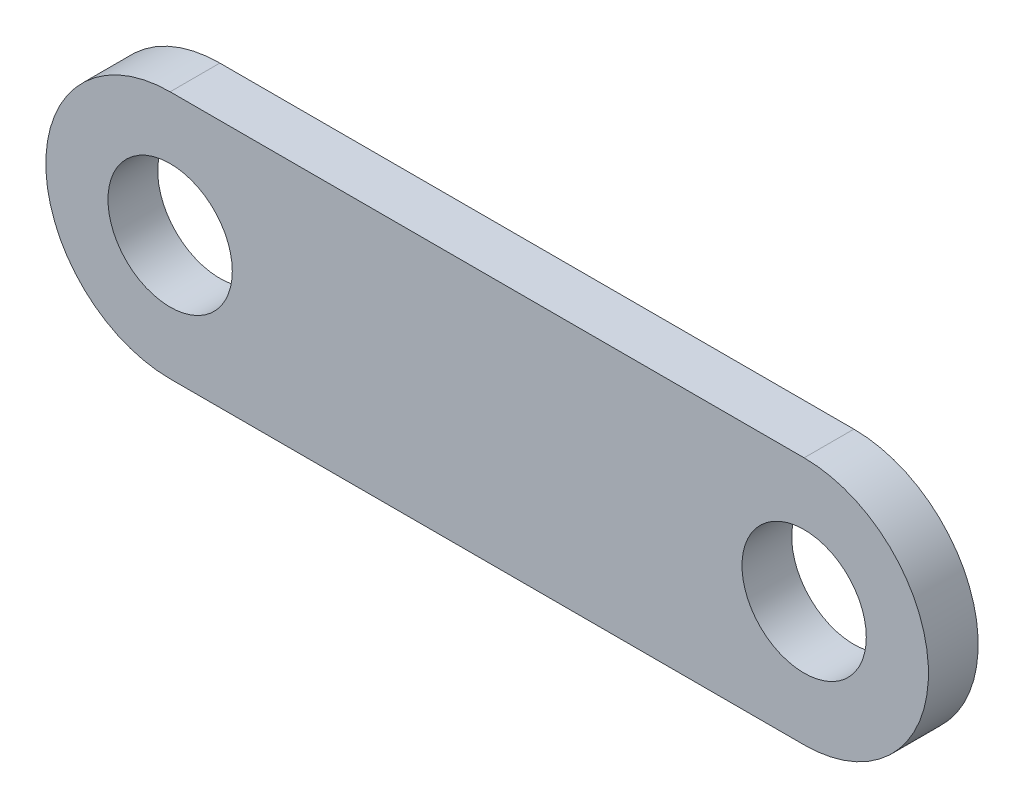
ISO-10303-21;
HEADER;
FILE_DESCRIPTION(('STEP AP214'),'2;1');
FILE_NAME('part.step','',(''),(''),'','','');
FILE_SCHEMA(('AUTOMOTIVE_DESIGN { 1 0 10303 214 1 1 1 1 }'));
ENDSEC;
DATA;
#1=APPLICATION_CONTEXT('core data for automotive mechanical design processes');
#2=APPLICATION_PROTOCOL_DEFINITION('international standard','automotive_design',2000,#1);
#3=PRODUCT_CONTEXT('',#1,'mechanical');
#4=PRODUCT('Part','Part','',(#3));
#5=PRODUCT_RELATED_PRODUCT_CATEGORY('part','',(#4));
#6=PRODUCT_DEFINITION_FORMATION('','',#4);
#7=PRODUCT_DEFINITION_CONTEXT('part definition',#1,'design');
#8=PRODUCT_DEFINITION('design','',#6,#7);
#9=PRODUCT_DEFINITION_SHAPE('','',#8);
#10=(LENGTH_UNIT() NAMED_UNIT(*) SI_UNIT(.MILLI.,.METRE.));
#11=(NAMED_UNIT(*) PLANE_ANGLE_UNIT() SI_UNIT($,.RADIAN.));
#12=(NAMED_UNIT(*) SI_UNIT($,.STERADIAN.) SOLID_ANGLE_UNIT());
#13=UNCERTAINTY_MEASURE_WITH_UNIT(LENGTH_MEASURE(1.E-05),#10,'distance_accuracy_value','');
#14=(GEOMETRIC_REPRESENTATION_CONTEXT(3) GLOBAL_UNCERTAINTY_ASSIGNED_CONTEXT((#13)) GLOBAL_UNIT_ASSIGNED_CONTEXT((#10,
#11,#12)) REPRESENTATION_CONTEXT('',''));
#15=CARTESIAN_POINT('',(0.,0.,0.));
#16=DIRECTION('',(0.,0.,1.));
#17=DIRECTION('',(1.,0.,0.));
#18=AXIS2_PLACEMENT_3D('',#15,#16,#17);
#19=CARTESIAN_POINT('',(0.,0.,10.));
#20=DIRECTION('',(0.,0.,1.));
#21=DIRECTION('',(1.,0.,0.));
#22=AXIS2_PLACEMENT_3D('',#19,#20,#21);
#23=PLANE('',#22);
#24=CARTESIAN_POINT('',(0.,0.,10.));
#25=DIRECTION('',(0.,0.,1.));
#26=DIRECTION('',(1.,0.,0.));
#27=AXIS2_PLACEMENT_3D('',#24,#25,#26);
#28=CIRCLE('',#27,25.);
#29=CARTESIAN_POINT('',(25.,0.,10.));
#30=VERTEX_POINT('',#29);
#31=EDGE_CURVE('E124',#30,#30,#28,.T.);
#32=ORIENTED_EDGE('',*,*,#31,.F.);
#33=EDGE_LOOP('',(#32));
#34=FACE_BOUND('',#33,.T.);
#35=CARTESIAN_POINT('',(0.,0.,10.));
#36=DIRECTION('',(0.,0.,1.));
#37=DIRECTION('',(1.,0.,0.));
#38=AXIS2_PLACEMENT_3D('',#35,#36,#37);
#39=CIRCLE('',#38,50.);
#40=CARTESIAN_POINT('',(0.,50.,10.));
#41=VERTEX_POINT('',#40);
#42=CARTESIAN_POINT('',(0.,-50.,10.));
#43=VERTEX_POINT('',#42);
#44=EDGE_CURVE('E104',#41,#43,#39,.T.);
#45=ORIENTED_EDGE('',*,*,#44,.T.);
#46=DIRECTION('',(1.,0.,0.));
#47=VECTOR('',#46,1.);
#48=CARTESIAN_POINT('',(0.,-50.,10.));
#49=LINE('',#48,#47);
#50=CARTESIAN_POINT('',(255.,-50.,10.));
#51=VERTEX_POINT('',#50);
#52=EDGE_CURVE('E99',#43,#51,#49,.T.);
#53=ORIENTED_EDGE('',*,*,#52,.T.);
#54=CARTESIAN_POINT('',(255.,0.,10.));
#55=DIRECTION('',(0.,0.,1.));
#56=DIRECTION('',(1.,0.,0.));
#57=AXIS2_PLACEMENT_3D('',#54,#55,#56);
#58=CIRCLE('',#57,50.);
#59=CARTESIAN_POINT('',(255.,50.,10.));
#60=VERTEX_POINT('',#59);
#61=EDGE_CURVE('E102',#51,#60,#58,.T.);
#62=ORIENTED_EDGE('',*,*,#61,.T.);
#63=DIRECTION('',(-1.,0.,0.));
#64=VECTOR('',#63,1.);
#65=CARTESIAN_POINT('',(0.,50.,10.));
#66=LINE('',#65,#64);
#67=EDGE_CURVE('E69',#60,#41,#66,.T.);
#68=ORIENTED_EDGE('',*,*,#67,.T.);
#69=EDGE_LOOP('',(#45,#53,#62,#68));
#70=FACE_BOUND('',#69,.T.);
#71=CARTESIAN_POINT('',(255.,0.,10.));
#72=DIRECTION('',(0.,0.,1.));
#73=DIRECTION('',(1.,0.,0.));
#74=AXIS2_PLACEMENT_3D('',#71,#72,#73);
#75=CIRCLE('',#74,25.);
#76=CARTESIAN_POINT('',(280.,0.,10.));
#77=VERTEX_POINT('',#76);
#78=EDGE_CURVE('E146',#77,#77,#75,.T.);
#79=ORIENTED_EDGE('',*,*,#78,.F.);
#80=EDGE_LOOP('',(#79));
#81=FACE_BOUND('',#80,.T.);
#82=ADVANCED_FACE('F51',(#34,#70,#81),#23,.T.);
#83=CARTESIAN_POINT('',(0.,0.,-10.));
#84=DIRECTION('',(0.,0.,1.));
#85=DIRECTION('',(1.,0.,0.));
#86=AXIS2_PLACEMENT_3D('',#83,#84,#85);
#87=PLANE('',#86);
#88=CARTESIAN_POINT('',(0.,0.,-10.));
#89=DIRECTION('',(0.,0.,1.));
#90=DIRECTION('',(1.,0.,0.));
#91=AXIS2_PLACEMENT_3D('',#88,#89,#90);
#92=CIRCLE('',#91,50.);
#93=CARTESIAN_POINT('',(0.,50.,-10.));
#94=VERTEX_POINT('',#93);
#95=CARTESIAN_POINT('',(0.,-50.,-10.));
#96=VERTEX_POINT('',#95);
#97=EDGE_CURVE('E120',#94,#96,#92,.T.);
#98=ORIENTED_EDGE('',*,*,#97,.F.);
#99=DIRECTION('',(-1.,0.,0.));
#100=VECTOR('',#99,1.);
#101=CARTESIAN_POINT('',(0.,50.,-10.));
#102=LINE('',#101,#100);
#103=CARTESIAN_POINT('',(255.,50.,-10.));
#104=VERTEX_POINT('',#103);
#105=EDGE_CURVE('E92',#104,#94,#102,.T.);
#106=ORIENTED_EDGE('',*,*,#105,.F.);
#107=CARTESIAN_POINT('',(255.,0.,-10.));
#108=DIRECTION('',(0.,0.,1.));
#109=DIRECTION('',(1.,0.,0.));
#110=AXIS2_PLACEMENT_3D('',#107,#108,#109);
#111=CIRCLE('',#110,50.);
#112=CARTESIAN_POINT('',(255.,-50.,-10.));
#113=VERTEX_POINT('',#112);
#114=EDGE_CURVE('E86',#113,#104,#111,.T.);
#115=ORIENTED_EDGE('',*,*,#114,.F.);
#116=DIRECTION('',(1.,0.,0.));
#117=VECTOR('',#116,1.);
#118=CARTESIAN_POINT('',(0.,-50.,-10.));
#119=LINE('',#118,#117);
#120=EDGE_CURVE('E109',#96,#113,#119,.T.);
#121=ORIENTED_EDGE('',*,*,#120,.F.);
#122=EDGE_LOOP('',(#98,#106,#115,#121));
#123=FACE_BOUND('',#122,.T.);
#124=CARTESIAN_POINT('',(0.,0.,-10.));
#125=DIRECTION('',(0.,0.,1.));
#126=DIRECTION('',(1.,0.,0.));
#127=AXIS2_PLACEMENT_3D('',#124,#125,#126);
#128=CIRCLE('',#127,25.);
#129=CARTESIAN_POINT('',(25.,0.,-10.));
#130=VERTEX_POINT('',#129);
#131=EDGE_CURVE('E142',#130,#130,#128,.T.);
#132=ORIENTED_EDGE('',*,*,#131,.T.);
#133=EDGE_LOOP('',(#132));
#134=FACE_BOUND('',#133,.T.);
#135=CARTESIAN_POINT('',(255.,0.,-10.));
#136=DIRECTION('',(0.,0.,1.));
#137=DIRECTION('',(1.,0.,0.));
#138=AXIS2_PLACEMENT_3D('',#135,#136,#137);
#139=CIRCLE('',#138,25.);
#140=CARTESIAN_POINT('',(280.,0.,-10.));
#141=VERTEX_POINT('',#140);
#142=EDGE_CURVE('E150',#141,#141,#139,.T.);
#143=ORIENTED_EDGE('',*,*,#142,.T.);
#144=EDGE_LOOP('',(#143));
#145=FACE_BOUND('',#144,.T.);
#146=ADVANCED_FACE('F137',(#123,#134,#145),#87,.F.);
#147=CARTESIAN_POINT('',(0.,0.,10.));
#148=DIRECTION('',(0.,0.,-1.));
#149=DIRECTION('',(-1.,0.,0.));
#150=AXIS2_PLACEMENT_3D('',#147,#148,#149);
#151=CYLINDRICAL_SURFACE('',#150,50.);
#152=ORIENTED_EDGE('',*,*,#97,.T.);
#153=DIRECTION('',(0.,0.,-1.));
#154=VECTOR('',#153,1.);
#155=CARTESIAN_POINT('',(0.,-50.,10.));
#156=LINE('',#155,#154);
#157=EDGE_CURVE('E11',#43,#96,#156,.T.);
#158=ORIENTED_EDGE('',*,*,#157,.F.);
#159=ORIENTED_EDGE('',*,*,#44,.F.);
#160=DIRECTION('',(0.,0.,-1.));
#161=VECTOR('',#160,1.);
#162=CARTESIAN_POINT('',(0.,50.,10.));
#163=LINE('',#162,#161);
#164=EDGE_CURVE('E116',#41,#94,#163,.T.);
#165=ORIENTED_EDGE('',*,*,#164,.T.);
#166=EDGE_LOOP('',(#152,#158,#159,#165));
#167=FACE_BOUND('',#166,.T.);
#168=ADVANCED_FACE('F53',(#167),#151,.T.);
#169=CARTESIAN_POINT('',(0.,-50.,10.));
#170=DIRECTION('',(0.,1.,0.));
#171=DIRECTION('',(0.,0.,1.));
#172=AXIS2_PLACEMENT_3D('',#169,#170,#171);
#173=PLANE('',#172);
#174=ORIENTED_EDGE('',*,*,#120,.T.);
#175=DIRECTION('',(0.,0.,-1.));
#176=VECTOR('',#175,1.);
#177=CARTESIAN_POINT('',(255.,-50.,10.));
#178=LINE('',#177,#176);
#179=EDGE_CURVE('E61',#51,#113,#178,.T.);
#180=ORIENTED_EDGE('',*,*,#179,.F.);
#181=ORIENTED_EDGE('',*,*,#52,.F.);
#182=ORIENTED_EDGE('',*,*,#157,.T.);
#183=EDGE_LOOP('',(#174,#180,#181,#182));
#184=FACE_BOUND('',#183,.T.);
#185=ADVANCED_FACE('F108',(#184),#173,.F.);
#186=CARTESIAN_POINT('',(255.,0.,10.));
#187=DIRECTION('',(0.,0.,-1.));
#188=DIRECTION('',(-1.,0.,0.));
#189=AXIS2_PLACEMENT_3D('',#186,#187,#188);
#190=CYLINDRICAL_SURFACE('',#189,50.);
#191=ORIENTED_EDGE('',*,*,#114,.T.);
#192=DIRECTION('',(0.,0.,-1.));
#193=VECTOR('',#192,1.);
#194=CARTESIAN_POINT('',(255.,50.,10.));
#195=LINE('',#194,#193);
#196=EDGE_CURVE('E111',#60,#104,#195,.T.);
#197=ORIENTED_EDGE('',*,*,#196,.F.);
#198=ORIENTED_EDGE('',*,*,#61,.F.);
#199=ORIENTED_EDGE('',*,*,#179,.T.);
#200=EDGE_LOOP('',(#191,#197,#198,#199));
#201=FACE_BOUND('',#200,.T.);
#202=ADVANCED_FACE('F112',(#201),#190,.T.);
#203=CARTESIAN_POINT('',(0.,50.,10.));
#204=DIRECTION('',(0.,-1.,0.));
#205=DIRECTION('',(0.,0.,-1.));
#206=AXIS2_PLACEMENT_3D('',#203,#204,#205);
#207=PLANE('',#206);
#208=ORIENTED_EDGE('',*,*,#105,.T.);
#209=ORIENTED_EDGE('',*,*,#164,.F.);
#210=ORIENTED_EDGE('',*,*,#67,.F.);
#211=ORIENTED_EDGE('',*,*,#196,.T.);
#212=EDGE_LOOP('',(#208,#209,#210,#211));
#213=FACE_BOUND('',#212,.T.);
#214=ADVANCED_FACE('F134',(#213),#207,.F.);
#215=CARTESIAN_POINT('',(0.,0.,10.));
#216=DIRECTION('',(0.,0.,-1.));
#217=DIRECTION('',(-1.,0.,0.));
#218=AXIS2_PLACEMENT_3D('',#215,#216,#217);
#219=CYLINDRICAL_SURFACE('',#218,25.);
#220=ORIENTED_EDGE('',*,*,#31,.T.);
#221=EDGE_LOOP('',(#220));
#222=FACE_BOUND('',#221,.T.);
#223=ORIENTED_EDGE('',*,*,#131,.F.);
#224=EDGE_LOOP('',(#223));
#225=FACE_BOUND('',#224,.T.);
#226=ADVANCED_FACE('F169',(#222,#225),#219,.F.);
#227=CARTESIAN_POINT('',(255.,0.,10.));
#228=DIRECTION('',(0.,0.,-1.));
#229=DIRECTION('',(-1.,0.,0.));
#230=AXIS2_PLACEMENT_3D('',#227,#228,#229);
#231=CYLINDRICAL_SURFACE('',#230,25.);
#232=ORIENTED_EDGE('',*,*,#78,.T.);
#233=EDGE_LOOP('',(#232));
#234=FACE_BOUND('',#233,.T.);
#235=ORIENTED_EDGE('',*,*,#142,.F.);
#236=EDGE_LOOP('',(#235));
#237=FACE_BOUND('',#236,.T.);
#238=ADVANCED_FACE('F158',(#234,#237),#231,.F.);
#239=CLOSED_SHELL('',(#82,#146,#168,#185,#202,#214,#226,#238));
#240=MANIFOLD_SOLID_BREP('B2',#239);
#241=ADVANCED_BREP_SHAPE_REPRESENTATION('',(#18,#240),#14);
#242=SHAPE_DEFINITION_REPRESENTATION(#9,#241);
ENDSEC;
END-ISO-10303-21;
